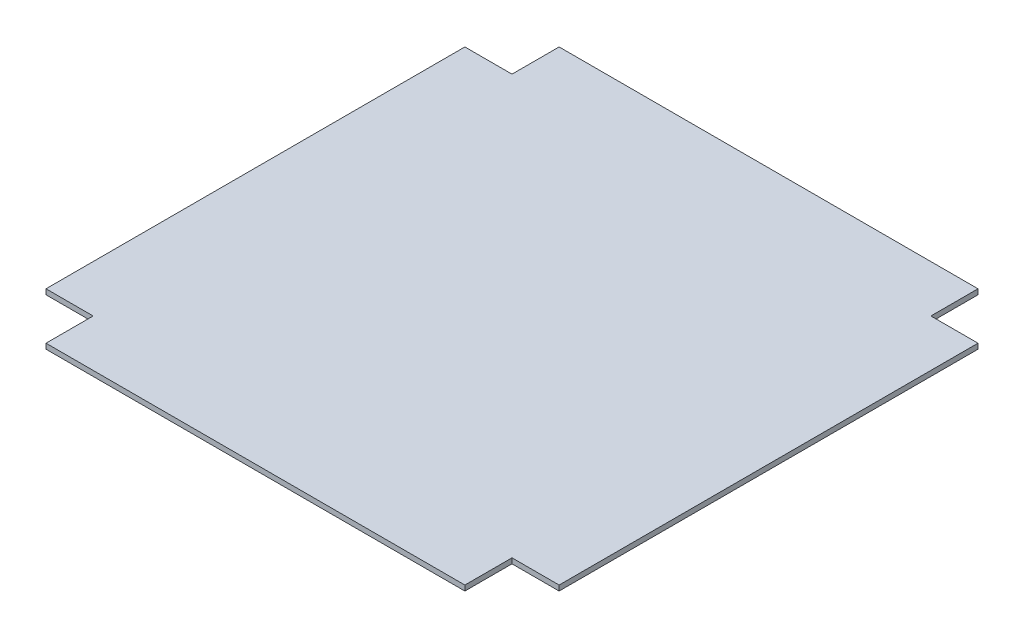
ISO-10303-21;
HEADER;
FILE_DESCRIPTION(('STEP AP214'),'2;1');
FILE_NAME('part.step','',(''),(''),'','','');
FILE_SCHEMA(('AUTOMOTIVE_DESIGN { 1 0 10303 214 1 1 1 1 }'));
ENDSEC;
DATA;
#1=APPLICATION_CONTEXT('core data for automotive mechanical design processes');
#2=APPLICATION_PROTOCOL_DEFINITION('international standard','automotive_design',2000,#1);
#3=PRODUCT_CONTEXT('',#1,'mechanical');
#4=PRODUCT('Part','Part','',(#3));
#5=PRODUCT_RELATED_PRODUCT_CATEGORY('part','',(#4));
#6=PRODUCT_DEFINITION_FORMATION('','',#4);
#7=PRODUCT_DEFINITION_CONTEXT('part definition',#1,'design');
#8=PRODUCT_DEFINITION('design','',#6,#7);
#9=PRODUCT_DEFINITION_SHAPE('','',#8);
#10=(LENGTH_UNIT() NAMED_UNIT(*) SI_UNIT(.MILLI.,.METRE.));
#11=(NAMED_UNIT(*) PLANE_ANGLE_UNIT() SI_UNIT($,.RADIAN.));
#12=(NAMED_UNIT(*) SI_UNIT($,.STERADIAN.) SOLID_ANGLE_UNIT());
#13=UNCERTAINTY_MEASURE_WITH_UNIT(LENGTH_MEASURE(1.E-05),#10,'distance_accuracy_value','');
#14=(GEOMETRIC_REPRESENTATION_CONTEXT(3) GLOBAL_UNCERTAINTY_ASSIGNED_CONTEXT((#13)) GLOBAL_UNIT_ASSIGNED_CONTEXT((#10,
#11,#12)) REPRESENTATION_CONTEXT('',''));
#15=CARTESIAN_POINT('',(0.,0.,0.));
#16=DIRECTION('',(0.,0.,1.));
#17=DIRECTION('',(1.,0.,0.));
#18=AXIS2_PLACEMENT_3D('',#15,#16,#17);
#19=CARTESIAN_POINT('',(-200.000000000002,5.,199.999999999998));
#20=DIRECTION('',(0.,0.,-1.));
#21=DIRECTION('',(-1.,0.,0.));
#22=AXIS2_PLACEMENT_3D('',#19,#20,#21);
#23=PLANE('',#22);
#24=DIRECTION('',(1.,0.,0.));
#25=VECTOR('',#24,1.);
#26=CARTESIAN_POINT('',(-200.000000000002,0.,199.999999999998));
#27=LINE('',#26,#25);
#28=CARTESIAN_POINT('',(-245.000000000002,0.,199.999999999997));
#29=VERTEX_POINT('',#28);
#30=CARTESIAN_POINT('',(-200.000000000002,0.,199.999999999998));
#31=VERTEX_POINT('',#30);
#32=EDGE_CURVE('E157',#29,#31,#27,.T.);
#33=ORIENTED_EDGE('',*,*,#32,.T.);
#34=DIRECTION('',(0.,-1.,0.));
#35=VECTOR('',#34,1.);
#36=CARTESIAN_POINT('',(-200.000000000002,5.,199.999999999998));
#37=LINE('',#36,#35);
#38=CARTESIAN_POINT('',(-200.000000000002,5.,199.999999999998));
#39=VERTEX_POINT('',#38);
#40=EDGE_CURVE('E42',#39,#31,#37,.T.);
#41=ORIENTED_EDGE('',*,*,#40,.F.);
#42=DIRECTION('',(1.,0.,0.));
#43=VECTOR('',#42,1.);
#44=CARTESIAN_POINT('',(-200.000000000002,5.,199.999999999998));
#45=LINE('',#44,#43);
#46=CARTESIAN_POINT('',(-245.000000000002,5.,199.999999999997));
#47=VERTEX_POINT('',#46);
#48=EDGE_CURVE('E106',#47,#39,#45,.T.);
#49=ORIENTED_EDGE('',*,*,#48,.F.);
#50=DIRECTION('',(0.,-1.,0.));
#51=VECTOR('',#50,1.);
#52=CARTESIAN_POINT('',(-245.000000000002,5.,199.999999999997));
#53=LINE('',#52,#51);
#54=EDGE_CURVE('E11',#47,#29,#53,.T.);
#55=ORIENTED_EDGE('',*,*,#54,.T.);
#56=EDGE_LOOP('',(#33,#41,#49,#55));
#57=FACE_BOUND('',#56,.T.);
#58=ADVANCED_FACE('F34',(#57),#23,.F.);
#59=CARTESIAN_POINT('',(-200.000000000003,5.,244.999999999998));
#60=DIRECTION('',(1.,0.,0.));
#61=DIRECTION('',(0.,0.,-1.));
#62=AXIS2_PLACEMENT_3D('',#59,#60,#61);
#63=PLANE('',#62);
#64=DIRECTION('',(0.,0.,1.));
#65=VECTOR('',#64,1.);
#66=CARTESIAN_POINT('',(-200.000000000003,0.,244.999999999998));
#67=LINE('',#66,#65);
#68=CARTESIAN_POINT('',(-200.000000000003,0.,244.999999999998));
#69=VERTEX_POINT('',#68);
#70=EDGE_CURVE('E159',#31,#69,#67,.T.);
#71=ORIENTED_EDGE('',*,*,#70,.T.);
#72=DIRECTION('',(0.,-1.,0.));
#73=VECTOR('',#72,1.);
#74=CARTESIAN_POINT('',(-200.000000000003,5.,244.999999999998));
#75=LINE('',#74,#73);
#76=CARTESIAN_POINT('',(-200.000000000003,5.,244.999999999998));
#77=VERTEX_POINT('',#76);
#78=EDGE_CURVE('E199',#77,#69,#75,.T.);
#79=ORIENTED_EDGE('',*,*,#78,.F.);
#80=DIRECTION('',(0.,0.,1.));
#81=VECTOR('',#80,1.);
#82=CARTESIAN_POINT('',(-200.000000000003,5.,244.999999999998));
#83=LINE('',#82,#81);
#84=EDGE_CURVE('E207',#39,#77,#83,.T.);
#85=ORIENTED_EDGE('',*,*,#84,.F.);
#86=ORIENTED_EDGE('',*,*,#40,.T.);
#87=EDGE_LOOP('',(#71,#79,#85,#86));
#88=FACE_BOUND('',#87,.T.);
#89=ADVANCED_FACE('F205',(#88),#63,.F.);
#90=CARTESIAN_POINT('',(200.,5.,245.));
#91=DIRECTION('',(0.,0.,-1.));
#92=DIRECTION('',(-1.,0.,0.));
#93=AXIS2_PLACEMENT_3D('',#90,#91,#92);
#94=PLANE('',#93);
#95=DIRECTION('',(1.,0.,0.));
#96=VECTOR('',#95,1.);
#97=CARTESIAN_POINT('',(200.,0.,245.));
#98=LINE('',#97,#96);
#99=CARTESIAN_POINT('',(200.,0.,245.));
#100=VERTEX_POINT('',#99);
#101=EDGE_CURVE('E162',#69,#100,#98,.T.);
#102=ORIENTED_EDGE('',*,*,#101,.T.);
#103=DIRECTION('',(0.,-1.,0.));
#104=VECTOR('',#103,1.);
#105=CARTESIAN_POINT('',(200.,5.,245.));
#106=LINE('',#105,#104);
#107=CARTESIAN_POINT('',(200.,5.,245.));
#108=VERTEX_POINT('',#107);
#109=EDGE_CURVE('E196',#108,#100,#106,.T.);
#110=ORIENTED_EDGE('',*,*,#109,.F.);
#111=DIRECTION('',(1.,0.,0.));
#112=VECTOR('',#111,1.);
#113=CARTESIAN_POINT('',(-200.000000000003,5.,244.999999999998));
#114=LINE('',#113,#112);
#115=EDGE_CURVE('E225',#77,#108,#114,.T.);
#116=ORIENTED_EDGE('',*,*,#115,.F.);
#117=ORIENTED_EDGE('',*,*,#78,.T.);
#118=EDGE_LOOP('',(#102,#110,#116,#117));
#119=FACE_BOUND('',#118,.T.);
#120=ADVANCED_FACE('F216',(#119),#94,.F.);
#121=CARTESIAN_POINT('',(200.,5.,200.));
#122=DIRECTION('',(-1.,0.,0.));
#123=DIRECTION('',(0.,0.,1.));
#124=AXIS2_PLACEMENT_3D('',#121,#122,#123);
#125=PLANE('',#124);
#126=DIRECTION('',(0.,0.,-1.));
#127=VECTOR('',#126,1.);
#128=CARTESIAN_POINT('',(200.,0.,200.));
#129=LINE('',#128,#127);
#130=CARTESIAN_POINT('',(200.,0.,200.));
#131=VERTEX_POINT('',#130);
#132=EDGE_CURVE('E164',#100,#131,#129,.T.);
#133=ORIENTED_EDGE('',*,*,#132,.T.);
#134=DIRECTION('',(0.,-1.,0.));
#135=VECTOR('',#134,1.);
#136=CARTESIAN_POINT('',(200.,5.,200.));
#137=LINE('',#136,#135);
#138=CARTESIAN_POINT('',(200.,5.,200.));
#139=VERTEX_POINT('',#138);
#140=EDGE_CURVE('E193',#139,#131,#137,.T.);
#141=ORIENTED_EDGE('',*,*,#140,.F.);
#142=DIRECTION('',(0.,0.,-1.));
#143=VECTOR('',#142,1.);
#144=CARTESIAN_POINT('',(200.,5.,200.));
#145=LINE('',#144,#143);
#146=EDGE_CURVE('E222',#108,#139,#145,.T.);
#147=ORIENTED_EDGE('',*,*,#146,.F.);
#148=ORIENTED_EDGE('',*,*,#109,.T.);
#149=EDGE_LOOP('',(#133,#141,#147,#148));
#150=FACE_BOUND('',#149,.T.);
#151=ADVANCED_FACE('F220',(#150),#125,.F.);
#152=CARTESIAN_POINT('',(245.,5.,200.));
#153=DIRECTION('',(0.,0.,-1.));
#154=DIRECTION('',(-1.,0.,0.));
#155=AXIS2_PLACEMENT_3D('',#152,#153,#154);
#156=PLANE('',#155);
#157=DIRECTION('',(1.,0.,0.));
#158=VECTOR('',#157,1.);
#159=CARTESIAN_POINT('',(245.,0.,200.));
#160=LINE('',#159,#158);
#161=CARTESIAN_POINT('',(245.,0.,200.));
#162=VERTEX_POINT('',#161);
#163=EDGE_CURVE('E166',#131,#162,#160,.T.);
#164=ORIENTED_EDGE('',*,*,#163,.T.);
#165=DIRECTION('',(0.,-1.,0.));
#166=VECTOR('',#165,1.);
#167=CARTESIAN_POINT('',(245.,5.,200.));
#168=LINE('',#167,#166);
#169=CARTESIAN_POINT('',(245.,5.,200.));
#170=VERTEX_POINT('',#169);
#171=EDGE_CURVE('E190',#170,#162,#168,.T.);
#172=ORIENTED_EDGE('',*,*,#171,.F.);
#173=DIRECTION('',(1.,0.,0.));
#174=VECTOR('',#173,1.);
#175=CARTESIAN_POINT('',(245.,5.,200.));
#176=LINE('',#175,#174);
#177=EDGE_CURVE('E224',#139,#170,#176,.T.);
#178=ORIENTED_EDGE('',*,*,#177,.F.);
#179=ORIENTED_EDGE('',*,*,#140,.T.);
#180=EDGE_LOOP('',(#164,#172,#178,#179));
#181=FACE_BOUND('',#180,.T.);
#182=ADVANCED_FACE('F267',(#181),#156,.F.);
#183=CARTESIAN_POINT('',(245.000000000001,5.,-199.999999999999));
#184=DIRECTION('',(-1.,0.,0.));
#185=DIRECTION('',(0.,0.,1.));
#186=AXIS2_PLACEMENT_3D('',#183,#184,#185);
#187=PLANE('',#186);
#188=DIRECTION('',(0.,0.,-1.));
#189=VECTOR('',#188,1.);
#190=CARTESIAN_POINT('',(245.000000000001,0.,-199.999999999999));
#191=LINE('',#190,#189);
#192=CARTESIAN_POINT('',(245.000000000001,0.,-199.999999999999));
#193=VERTEX_POINT('',#192);
#194=EDGE_CURVE('E169',#162,#193,#191,.T.);
#195=ORIENTED_EDGE('',*,*,#194,.T.);
#196=DIRECTION('',(0.,-1.,0.));
#197=VECTOR('',#196,1.);
#198=CARTESIAN_POINT('',(245.000000000001,5.,-199.999999999999));
#199=LINE('',#198,#197);
#200=CARTESIAN_POINT('',(245.000000000001,5.,-199.999999999999));
#201=VERTEX_POINT('',#200);
#202=EDGE_CURVE('E187',#201,#193,#199,.T.);
#203=ORIENTED_EDGE('',*,*,#202,.F.);
#204=DIRECTION('',(0.,0.,-1.));
#205=VECTOR('',#204,1.);
#206=CARTESIAN_POINT('',(245.,5.,200.));
#207=LINE('',#206,#205);
#208=EDGE_CURVE('E227',#170,#201,#207,.T.);
#209=ORIENTED_EDGE('',*,*,#208,.F.);
#210=ORIENTED_EDGE('',*,*,#171,.T.);
#211=EDGE_LOOP('',(#195,#203,#209,#210));
#212=FACE_BOUND('',#211,.T.);
#213=ADVANCED_FACE('F270',(#212),#187,.F.);
#214=CARTESIAN_POINT('',(200.000000000001,5.,-199.999999999999));
#215=DIRECTION('',(0.,0.,1.));
#216=DIRECTION('',(1.,0.,0.));
#217=AXIS2_PLACEMENT_3D('',#214,#215,#216);
#218=PLANE('',#217);
#219=DIRECTION('',(-1.,0.,0.));
#220=VECTOR('',#219,1.);
#221=CARTESIAN_POINT('',(200.000000000001,0.,-199.999999999999));
#222=LINE('',#221,#220);
#223=CARTESIAN_POINT('',(200.000000000001,0.,-199.999999999999));
#224=VERTEX_POINT('',#223);
#225=EDGE_CURVE('E171',#193,#224,#222,.T.);
#226=ORIENTED_EDGE('',*,*,#225,.T.);
#227=DIRECTION('',(0.,-1.,0.));
#228=VECTOR('',#227,1.);
#229=CARTESIAN_POINT('',(200.000000000001,5.,-199.999999999999));
#230=LINE('',#229,#228);
#231=CARTESIAN_POINT('',(200.000000000001,5.,-199.999999999999));
#232=VERTEX_POINT('',#231);
#233=EDGE_CURVE('E184',#232,#224,#230,.T.);
#234=ORIENTED_EDGE('',*,*,#233,.F.);
#235=DIRECTION('',(-1.,0.,0.));
#236=VECTOR('',#235,1.);
#237=CARTESIAN_POINT('',(200.000000000001,5.,-199.999999999999));
#238=LINE('',#237,#236);
#239=EDGE_CURVE('E233',#201,#232,#238,.T.);
#240=ORIENTED_EDGE('',*,*,#239,.F.);
#241=ORIENTED_EDGE('',*,*,#202,.T.);
#242=EDGE_LOOP('',(#226,#234,#240,#241));
#243=FACE_BOUND('',#242,.T.);
#244=ADVANCED_FACE('F239',(#243),#218,.F.);
#245=CARTESIAN_POINT('',(200.000000000001,5.,-244.999999999999));
#246=DIRECTION('',(-1.,0.,0.));
#247=DIRECTION('',(0.,0.,1.));
#248=AXIS2_PLACEMENT_3D('',#245,#246,#247);
#249=PLANE('',#248);
#250=DIRECTION('',(0.,0.,-1.));
#251=VECTOR('',#250,1.);
#252=CARTESIAN_POINT('',(200.000000000001,0.,-244.999999999999));
#253=LINE('',#252,#251);
#254=CARTESIAN_POINT('',(200.000000000001,0.,-244.999999999999));
#255=VERTEX_POINT('',#254);
#256=EDGE_CURVE('E173',#224,#255,#253,.T.);
#257=ORIENTED_EDGE('',*,*,#256,.T.);
#258=DIRECTION('',(0.,-1.,0.));
#259=VECTOR('',#258,1.);
#260=CARTESIAN_POINT('',(200.000000000001,5.,-244.999999999999));
#261=LINE('',#260,#259);
#262=CARTESIAN_POINT('',(200.000000000001,5.,-244.999999999999));
#263=VERTEX_POINT('',#262);
#264=EDGE_CURVE('E146',#263,#255,#261,.T.);
#265=ORIENTED_EDGE('',*,*,#264,.F.);
#266=DIRECTION('',(0.,0.,-1.));
#267=VECTOR('',#266,1.);
#268=CARTESIAN_POINT('',(200.000000000001,5.,-244.999999999999));
#269=LINE('',#268,#267);
#270=EDGE_CURVE('E138',#232,#263,#269,.T.);
#271=ORIENTED_EDGE('',*,*,#270,.F.);
#272=ORIENTED_EDGE('',*,*,#233,.T.);
#273=EDGE_LOOP('',(#257,#265,#271,#272));
#274=FACE_BOUND('',#273,.T.);
#275=ADVANCED_FACE('F243',(#274),#249,.F.);
#276=CARTESIAN_POINT('',(-200.,5.,-245.));
#277=DIRECTION('',(0.,0.,1.));
#278=DIRECTION('',(1.,0.,0.));
#279=AXIS2_PLACEMENT_3D('',#276,#277,#278);
#280=PLANE('',#279);
#281=DIRECTION('',(-1.,0.,0.));
#282=VECTOR('',#281,1.);
#283=CARTESIAN_POINT('',(-200.,0.,-245.));
#284=LINE('',#283,#282);
#285=CARTESIAN_POINT('',(-200.,0.,-245.));
#286=VERTEX_POINT('',#285);
#287=EDGE_CURVE('E145',#255,#286,#284,.T.);
#288=ORIENTED_EDGE('',*,*,#287,.T.);
#289=DIRECTION('',(0.,-1.,0.));
#290=VECTOR('',#289,1.);
#291=CARTESIAN_POINT('',(-200.,5.,-245.));
#292=LINE('',#291,#290);
#293=CARTESIAN_POINT('',(-200.,5.,-245.));
#294=VERTEX_POINT('',#293);
#295=EDGE_CURVE('E143',#294,#286,#292,.T.);
#296=ORIENTED_EDGE('',*,*,#295,.F.);
#297=DIRECTION('',(-1.,0.,0.));
#298=VECTOR('',#297,1.);
#299=CARTESIAN_POINT('',(200.000000000001,5.,-244.999999999999));
#300=LINE('',#299,#298);
#301=EDGE_CURVE('E132',#263,#294,#300,.T.);
#302=ORIENTED_EDGE('',*,*,#301,.F.);
#303=ORIENTED_EDGE('',*,*,#264,.T.);
#304=EDGE_LOOP('',(#288,#296,#302,#303));
#305=FACE_BOUND('',#304,.T.);
#306=ADVANCED_FACE('F144',(#305),#280,.F.);
#307=CARTESIAN_POINT('',(-200.,5.,-200.));
#308=DIRECTION('',(1.,0.,0.));
#309=DIRECTION('',(0.,0.,-1.));
#310=AXIS2_PLACEMENT_3D('',#307,#308,#309);
#311=PLANE('',#310);
#312=DIRECTION('',(0.,0.,1.));
#313=VECTOR('',#312,1.);
#314=CARTESIAN_POINT('',(-200.,0.,-200.));
#315=LINE('',#314,#313);
#316=CARTESIAN_POINT('',(-200.,0.,-200.));
#317=VERTEX_POINT('',#316);
#318=EDGE_CURVE('E92',#286,#317,#315,.T.);
#319=ORIENTED_EDGE('',*,*,#318,.T.);
#320=DIRECTION('',(0.,-1.,0.));
#321=VECTOR('',#320,1.);
#322=CARTESIAN_POINT('',(-200.,5.,-200.));
#323=LINE('',#322,#321);
#324=CARTESIAN_POINT('',(-200.,5.,-200.));
#325=VERTEX_POINT('',#324);
#326=EDGE_CURVE('E147',#325,#317,#323,.T.);
#327=ORIENTED_EDGE('',*,*,#326,.F.);
#328=DIRECTION('',(0.,0.,1.));
#329=VECTOR('',#328,1.);
#330=CARTESIAN_POINT('',(-200.,5.,-200.));
#331=LINE('',#330,#329);
#332=EDGE_CURVE('E136',#294,#325,#331,.T.);
#333=ORIENTED_EDGE('',*,*,#332,.F.);
#334=ORIENTED_EDGE('',*,*,#295,.T.);
#335=EDGE_LOOP('',(#319,#327,#333,#334));
#336=FACE_BOUND('',#335,.T.);
#337=ADVANCED_FACE('F149',(#336),#311,.F.);
#338=CARTESIAN_POINT('',(-245.,5.,-200.));
#339=DIRECTION('',(0.,0.,1.));
#340=DIRECTION('',(1.,0.,0.));
#341=AXIS2_PLACEMENT_3D('',#338,#339,#340);
#342=PLANE('',#341);
#343=DIRECTION('',(-1.,0.,0.));
#344=VECTOR('',#343,1.);
#345=CARTESIAN_POINT('',(-245.,0.,-200.));
#346=LINE('',#345,#344);
#347=CARTESIAN_POINT('',(-245.,0.,-200.));
#348=VERTEX_POINT('',#347);
#349=EDGE_CURVE('E99',#317,#348,#346,.T.);
#350=ORIENTED_EDGE('',*,*,#349,.T.);
#351=DIRECTION('',(0.,-1.,0.));
#352=VECTOR('',#351,1.);
#353=CARTESIAN_POINT('',(-245.,5.,-200.));
#354=LINE('',#353,#352);
#355=CARTESIAN_POINT('',(-245.,5.,-200.));
#356=VERTEX_POINT('',#355);
#357=EDGE_CURVE('E153',#356,#348,#354,.T.);
#358=ORIENTED_EDGE('',*,*,#357,.F.);
#359=DIRECTION('',(-1.,0.,0.));
#360=VECTOR('',#359,1.);
#361=CARTESIAN_POINT('',(-245.,5.,-200.));
#362=LINE('',#361,#360);
#363=EDGE_CURVE('E151',#325,#356,#362,.T.);
#364=ORIENTED_EDGE('',*,*,#363,.F.);
#365=ORIENTED_EDGE('',*,*,#326,.T.);
#366=EDGE_LOOP('',(#350,#358,#364,#365));
#367=FACE_BOUND('',#366,.T.);
#368=ADVANCED_FACE('F245',(#367),#342,.F.);
#369=CARTESIAN_POINT('',(-245.,5.,-200.));
#370=DIRECTION('',(1.,0.,0.));
#371=DIRECTION('',(0.,0.,-1.));
#372=AXIS2_PLACEMENT_3D('',#369,#370,#371);
#373=PLANE('',#372);
#374=DIRECTION('',(0.,0.,1.));
#375=VECTOR('',#374,1.);
#376=CARTESIAN_POINT('',(-245.,0.,-200.));
#377=LINE('',#376,#375);
#378=EDGE_CURVE('E179',#348,#29,#377,.T.);
#379=ORIENTED_EDGE('',*,*,#378,.T.);
#380=ORIENTED_EDGE('',*,*,#54,.F.);
#381=DIRECTION('',(0.,0.,1.));
#382=VECTOR('',#381,1.);
#383=CARTESIAN_POINT('',(-245.000000000002,5.,199.999999999997));
#384=LINE('',#383,#382);
#385=EDGE_CURVE('E50',#356,#47,#384,.T.);
#386=ORIENTED_EDGE('',*,*,#385,.F.);
#387=ORIENTED_EDGE('',*,*,#357,.T.);
#388=EDGE_LOOP('',(#379,#380,#386,#387));
#389=FACE_BOUND('',#388,.T.);
#390=ADVANCED_FACE('F244',(#389),#373,.F.);
#391=CARTESIAN_POINT('',(0.,5.,0.));
#392=DIRECTION('',(0.,-1.,0.));
#393=DIRECTION('',(0.,0.,-1.));
#394=AXIS2_PLACEMENT_3D('',#391,#392,#393);
#395=PLANE('',#394);
#396=ORIENTED_EDGE('',*,*,#385,.T.);
#397=ORIENTED_EDGE('',*,*,#48,.T.);
#398=ORIENTED_EDGE('',*,*,#84,.T.);
#399=ORIENTED_EDGE('',*,*,#115,.T.);
#400=ORIENTED_EDGE('',*,*,#146,.T.);
#401=ORIENTED_EDGE('',*,*,#177,.T.);
#402=ORIENTED_EDGE('',*,*,#208,.T.);
#403=ORIENTED_EDGE('',*,*,#239,.T.);
#404=ORIENTED_EDGE('',*,*,#270,.T.);
#405=ORIENTED_EDGE('',*,*,#301,.T.);
#406=ORIENTED_EDGE('',*,*,#332,.T.);
#407=ORIENTED_EDGE('',*,*,#363,.T.);
#408=EDGE_LOOP('',(#396,#397,#398,#399,#400,#401,#402,#403,#404,#405,#406,#407));
#409=FACE_BOUND('',#408,.T.);
#410=ADVANCED_FACE('F134',(#409),#395,.F.);
#411=CARTESIAN_POINT('',(0.,0.,0.));
#412=DIRECTION('',(0.,-1.,0.));
#413=DIRECTION('',(0.,0.,-1.));
#414=AXIS2_PLACEMENT_3D('',#411,#412,#413);
#415=PLANE('',#414);
#416=ORIENTED_EDGE('',*,*,#32,.F.);
#417=ORIENTED_EDGE('',*,*,#378,.F.);
#418=ORIENTED_EDGE('',*,*,#349,.F.);
#419=ORIENTED_EDGE('',*,*,#318,.F.);
#420=ORIENTED_EDGE('',*,*,#287,.F.);
#421=ORIENTED_EDGE('',*,*,#256,.F.);
#422=ORIENTED_EDGE('',*,*,#225,.F.);
#423=ORIENTED_EDGE('',*,*,#194,.F.);
#424=ORIENTED_EDGE('',*,*,#163,.F.);
#425=ORIENTED_EDGE('',*,*,#132,.F.);
#426=ORIENTED_EDGE('',*,*,#101,.F.);
#427=ORIENTED_EDGE('',*,*,#70,.F.);
#428=EDGE_LOOP('',(#416,#417,#418,#419,#420,#421,#422,#423,#424,#425,#426,#427));
#429=FACE_BOUND('',#428,.T.);
#430=ADVANCED_FACE('F210',(#429),#415,.T.);
#431=CLOSED_SHELL('',(#58,#89,#120,#151,#182,#213,#244,#275,#306,#337,#368,#390,#410,#430));
#432=MANIFOLD_SOLID_BREP('B2',#431);
#433=ADVANCED_BREP_SHAPE_REPRESENTATION('',(#18,#432),#14);
#434=SHAPE_DEFINITION_REPRESENTATION(#9,#433);
ENDSEC;
END-ISO-10303-21;
